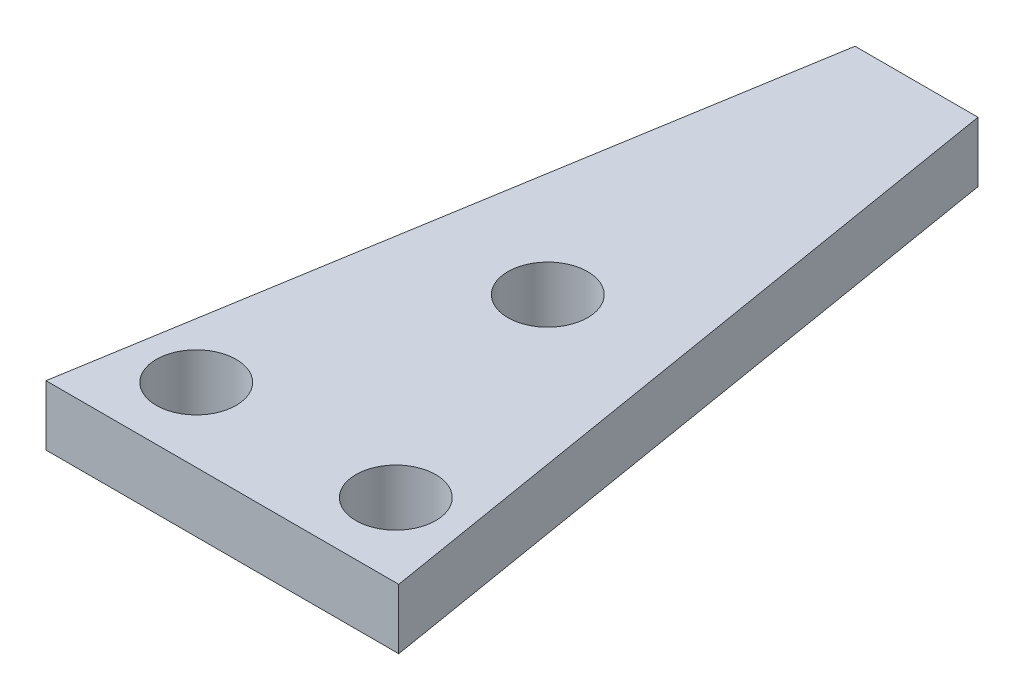
ISO-10303-21;
HEADER;
FILE_DESCRIPTION(('STEP AP214'),'2;1');
FILE_NAME('part.step','',(''),(''),'','','');
FILE_SCHEMA(('AUTOMOTIVE_DESIGN { 1 0 10303 214 1 1 1 1 }'));
ENDSEC;
DATA;
#1=APPLICATION_CONTEXT('core data for automotive mechanical design processes');
#2=APPLICATION_PROTOCOL_DEFINITION('international standard','automotive_design',2000,#1);
#3=PRODUCT_CONTEXT('',#1,'mechanical');
#4=PRODUCT('Part','Part','',(#3));
#5=PRODUCT_RELATED_PRODUCT_CATEGORY('part','',(#4));
#6=PRODUCT_DEFINITION_FORMATION('','',#4);
#7=PRODUCT_DEFINITION_CONTEXT('part definition',#1,'design');
#8=PRODUCT_DEFINITION('design','',#6,#7);
#9=PRODUCT_DEFINITION_SHAPE('','',#8);
#10=(LENGTH_UNIT() NAMED_UNIT(*) SI_UNIT(.MILLI.,.METRE.));
#11=(NAMED_UNIT(*) PLANE_ANGLE_UNIT() SI_UNIT($,.RADIAN.));
#12=(NAMED_UNIT(*) SI_UNIT($,.STERADIAN.) SOLID_ANGLE_UNIT());
#13=UNCERTAINTY_MEASURE_WITH_UNIT(LENGTH_MEASURE(1.E-05),#10,'distance_accuracy_value','');
#14=(GEOMETRIC_REPRESENTATION_CONTEXT(3) GLOBAL_UNCERTAINTY_ASSIGNED_CONTEXT((#13)) GLOBAL_UNIT_ASSIGNED_CONTEXT((#10,
#11,#12)) REPRESENTATION_CONTEXT('',''));
#15=CARTESIAN_POINT('',(0.,0.,0.));
#16=DIRECTION('',(0.,0.,1.));
#17=DIRECTION('',(1.,0.,0.));
#18=AXIS2_PLACEMENT_3D('',#15,#16,#17);
#19=CARTESIAN_POINT('',(0.,-2.39395,0.));
#20=DIRECTION('',(0.,1.,0.));
#21=DIRECTION('',(0.,0.,1.));
#22=AXIS2_PLACEMENT_3D('',#19,#20,#21);
#23=PLANE('',#22);
#24=DIRECTION('',(-1.,0.,0.));
#25=VECTOR('',#24,1.);
#26=CARTESIAN_POINT('',(0.,-2.39395,-9.68375));
#27=LINE('',#26,#25);
#28=CARTESIAN_POINT('',(18.6295862068966,-2.39395,-9.68375));
#29=VERTEX_POINT('',#28);
#30=CARTESIAN_POINT('',(-18.6295862068965,-2.39395,-9.68375));
#31=VERTEX_POINT('',#30);
#32=EDGE_CURVE('E117',#29,#31,#27,.T.);
#33=ORIENTED_EDGE('',*,*,#32,.T.);
#34=DIRECTION('',(-0.163295536240029,0.,0.986577198116844));
#35=VECTOR('',#34,1.);
#36=CARTESIAN_POINT('',(-19.692907735753,-2.39395,-3.2595157631591));
#37=LINE('',#36,#35);
#38=CARTESIAN_POINT('',(-6.49401751743431,-2.39395,-83.0028108321678));
#39=VERTEX_POINT('',#38);
#40=EDGE_CURVE('E123',#39,#31,#37,.T.);
#41=ORIENTED_EDGE('',*,*,#40,.F.);
#42=DIRECTION('',(1.,0.,0.));
#43=VECTOR('',#42,1.);
#44=CARTESIAN_POINT('',(0.,-2.39395,-83.0028108321678));
#45=LINE('',#44,#43);
#46=CARTESIAN_POINT('',(6.49401751743428,-2.39395,-83.0028108321678));
#47=VERTEX_POINT('',#46);
#48=EDGE_CURVE('E121',#39,#47,#45,.T.);
#49=ORIENTED_EDGE('',*,*,#48,.T.);
#50=DIRECTION('',(-0.163295536240029,0.,-0.986577198116843));
#51=VECTOR('',#50,1.);
#52=CARTESIAN_POINT('',(19.692907735753,-2.39395,-3.25951576315911));
#53=LINE('',#52,#51);
#54=EDGE_CURVE('E99',#29,#47,#53,.T.);
#55=ORIENTED_EDGE('',*,*,#54,.F.);
#56=EDGE_LOOP('',(#33,#41,#49,#55));
#57=FACE_BOUND('',#56,.T.);
#58=CARTESIAN_POINT('',(-10.541,-2.39395,-17.4625));
#59=DIRECTION('',(0.,1.,0.));
#60=DIRECTION('',(0.,0.,1.));
#61=AXIS2_PLACEMENT_3D('',#58,#59,#60);
#62=CIRCLE('',#61,4.2164);
#63=CARTESIAN_POINT('',(-10.541,-2.39395,-13.2461));
#64=VERTEX_POINT('',#63);
#65=EDGE_CURVE('E125',#64,#64,#62,.F.);
#66=ORIENTED_EDGE('',*,*,#65,.F.);
#67=EDGE_LOOP('',(#66));
#68=FACE_BOUND('',#67,.T.);
#69=CARTESIAN_POINT('',(10.541,-2.39395,-17.4625));
#70=DIRECTION('',(0.,1.,0.));
#71=DIRECTION('',(0.,0.,1.));
#72=AXIS2_PLACEMENT_3D('',#69,#70,#71);
#73=CIRCLE('',#72,4.2164);
#74=CARTESIAN_POINT('',(10.541,-2.39395,-13.2461));
#75=VERTEX_POINT('',#74);
#76=EDGE_CURVE('E128',#75,#75,#73,.F.);
#77=ORIENTED_EDGE('',*,*,#76,.F.);
#78=EDGE_LOOP('',(#77));
#79=FACE_BOUND('',#78,.T.);
#80=CARTESIAN_POINT('',(0.,-2.39395,-44.053125));
#81=DIRECTION('',(0.,1.,0.));
#82=DIRECTION('',(0.,0.,1.));
#83=AXIS2_PLACEMENT_3D('',#80,#81,#82);
#84=CIRCLE('',#83,4.2164);
#85=CARTESIAN_POINT('',(0.,-2.39395,-39.836725));
#86=VERTEX_POINT('',#85);
#87=EDGE_CURVE('E131',#86,#86,#84,.F.);
#88=ORIENTED_EDGE('',*,*,#87,.F.);
#89=EDGE_LOOP('',(#88));
#90=FACE_BOUND('',#89,.T.);
#91=ADVANCED_FACE('F43',(#57,#68,#79,#90),#23,.F.);
#92=CARTESIAN_POINT('',(-19.692907735753,3.95605,-3.2595157631591));
#93=DIRECTION('',(0.986577198116844,0.,0.163295536240029));
#94=DIRECTION('',(0.163295536240029,0.,-0.986577198116844));
#95=AXIS2_PLACEMENT_3D('',#92,#93,#94);
#96=PLANE('',#95);
#97=ORIENTED_EDGE('',*,*,#40,.T.);
#98=DIRECTION('',(0.,-1.,0.));
#99=VECTOR('',#98,1.);
#100=CARTESIAN_POINT('',(-18.6295862068965,3.95605,-9.68375));
#101=LINE('',#100,#99);
#102=CARTESIAN_POINT('',(-18.6295862068965,3.95605,-9.68375));
#103=VERTEX_POINT('',#102);
#104=EDGE_CURVE('E82',#103,#31,#101,.T.);
#105=ORIENTED_EDGE('',*,*,#104,.F.);
#106=DIRECTION('',(-0.163295536240029,0.,0.986577198116844));
#107=VECTOR('',#106,1.);
#108=CARTESIAN_POINT('',(-19.692907735753,3.95605,-3.2595157631591));
#109=LINE('',#108,#107);
#110=CARTESIAN_POINT('',(-6.49401751743431,3.95605,-83.0028108321678));
#111=VERTEX_POINT('',#110);
#112=EDGE_CURVE('E60',#111,#103,#109,.T.);
#113=ORIENTED_EDGE('',*,*,#112,.F.);
#114=DIRECTION('',(0.,-1.,0.));
#115=VECTOR('',#114,1.);
#116=CARTESIAN_POINT('',(-6.49401751743431,3.95605,-83.0028108321678));
#117=LINE('',#116,#115);
#118=EDGE_CURVE('E75',#111,#39,#117,.T.);
#119=ORIENTED_EDGE('',*,*,#118,.T.);
#120=EDGE_LOOP('',(#97,#105,#113,#119));
#121=FACE_BOUND('',#120,.T.);
#122=ADVANCED_FACE('F138',(#121),#96,.F.);
#123=CARTESIAN_POINT('',(0.,3.95605,-9.68375));
#124=DIRECTION('',(0.,0.,1.));
#125=DIRECTION('',(1.,0.,0.));
#126=AXIS2_PLACEMENT_3D('',#123,#124,#125);
#127=PLANE('',#126);
#128=ORIENTED_EDGE('',*,*,#32,.F.);
#129=DIRECTION('',(0.,-1.,0.));
#130=VECTOR('',#129,1.);
#131=CARTESIAN_POINT('',(18.6295862068966,3.95605,-9.68375));
#132=LINE('',#131,#130);
#133=CARTESIAN_POINT('',(18.6295862068966,3.95605,-9.68375));
#134=VERTEX_POINT('',#133);
#135=EDGE_CURVE('E11',#134,#29,#132,.T.);
#136=ORIENTED_EDGE('',*,*,#135,.F.);
#137=DIRECTION('',(-1.,0.,0.));
#138=VECTOR('',#137,1.);
#139=CARTESIAN_POINT('',(0.,3.95605,-9.68375));
#140=LINE('',#139,#138);
#141=EDGE_CURVE('E93',#134,#103,#140,.T.);
#142=ORIENTED_EDGE('',*,*,#141,.T.);
#143=ORIENTED_EDGE('',*,*,#104,.T.);
#144=EDGE_LOOP('',(#128,#136,#142,#143));
#145=FACE_BOUND('',#144,.T.);
#146=ADVANCED_FACE('F45',(#145),#127,.T.);
#147=CARTESIAN_POINT('',(0.,3.95605,0.));
#148=DIRECTION('',(0.,1.,0.));
#149=DIRECTION('',(0.,0.,1.));
#150=AXIS2_PLACEMENT_3D('',#147,#148,#149);
#151=PLANE('',#150);
#152=ORIENTED_EDGE('',*,*,#141,.F.);
#153=DIRECTION('',(-0.163295536240029,0.,-0.986577198116843));
#154=VECTOR('',#153,1.);
#155=CARTESIAN_POINT('',(19.692907735753,3.95605,-3.25951576315911));
#156=LINE('',#155,#154);
#157=CARTESIAN_POINT('',(6.49401751743428,3.95605,-83.0028108321678));
#158=VERTEX_POINT('',#157);
#159=EDGE_CURVE('E87',#134,#158,#156,.T.);
#160=ORIENTED_EDGE('',*,*,#159,.T.);
#161=DIRECTION('',(1.,0.,0.));
#162=VECTOR('',#161,1.);
#163=CARTESIAN_POINT('',(0.,3.95605,-83.0028108321678));
#164=LINE('',#163,#162);
#165=EDGE_CURVE('E92',#111,#158,#164,.T.);
#166=ORIENTED_EDGE('',*,*,#165,.F.);
#167=ORIENTED_EDGE('',*,*,#112,.T.);
#168=EDGE_LOOP('',(#152,#160,#166,#167));
#169=FACE_BOUND('',#168,.T.);
#170=CARTESIAN_POINT('',(-10.541,3.95605,-17.4625));
#171=DIRECTION('',(0.,1.,0.));
#172=DIRECTION('',(0.,0.,1.));
#173=AXIS2_PLACEMENT_3D('',#170,#171,#172);
#174=CIRCLE('',#173,4.2164);
#175=CARTESIAN_POINT('',(-10.541,3.95605,-13.2461));
#176=VERTEX_POINT('',#175);
#177=EDGE_CURVE('E105',#176,#176,#174,.F.);
#178=ORIENTED_EDGE('',*,*,#177,.T.);
#179=EDGE_LOOP('',(#178));
#180=FACE_BOUND('',#179,.T.);
#181=CARTESIAN_POINT('',(10.541,3.95605,-17.4625));
#182=DIRECTION('',(0.,1.,0.));
#183=DIRECTION('',(0.,0.,1.));
#184=AXIS2_PLACEMENT_3D('',#181,#182,#183);
#185=CIRCLE('',#184,4.2164);
#186=CARTESIAN_POINT('',(10.541,3.95605,-13.2461));
#187=VERTEX_POINT('',#186);
#188=EDGE_CURVE('E111',#187,#187,#185,.F.);
#189=ORIENTED_EDGE('',*,*,#188,.T.);
#190=EDGE_LOOP('',(#189));
#191=FACE_BOUND('',#190,.T.);
#192=CARTESIAN_POINT('',(0.,3.95605,-44.053125));
#193=DIRECTION('',(0.,1.,0.));
#194=DIRECTION('',(0.,0.,1.));
#195=AXIS2_PLACEMENT_3D('',#192,#193,#194);
#196=CIRCLE('',#195,4.2164);
#197=CARTESIAN_POINT('',(0.,3.95605,-39.836725));
#198=VERTEX_POINT('',#197);
#199=EDGE_CURVE('E114',#198,#198,#196,.F.);
#200=ORIENTED_EDGE('',*,*,#199,.T.);
#201=EDGE_LOOP('',(#200));
#202=FACE_BOUND('',#201,.T.);
#203=ADVANCED_FACE('F89',(#169,#180,#191,#202),#151,.T.);
#204=CARTESIAN_POINT('',(0.,3.95605,-44.053125));
#205=DIRECTION('',(0.,-1.,0.));
#206=DIRECTION('',(0.,0.,-1.));
#207=AXIS2_PLACEMENT_3D('',#204,#205,#206);
#208=CYLINDRICAL_SURFACE('',#207,4.2164);
#209=ORIENTED_EDGE('',*,*,#199,.F.);
#210=EDGE_LOOP('',(#209));
#211=FACE_BOUND('',#210,.T.);
#212=ORIENTED_EDGE('',*,*,#87,.T.);
#213=EDGE_LOOP('',(#212));
#214=FACE_BOUND('',#213,.T.);
#215=ADVANCED_FACE('F142',(#211,#214),#208,.F.);
#216=CARTESIAN_POINT('',(10.541,3.95605,-17.4625));
#217=DIRECTION('',(0.,-1.,0.));
#218=DIRECTION('',(0.,0.,-1.));
#219=AXIS2_PLACEMENT_3D('',#216,#217,#218);
#220=CYLINDRICAL_SURFACE('',#219,4.2164);
#221=ORIENTED_EDGE('',*,*,#188,.F.);
#222=EDGE_LOOP('',(#221));
#223=FACE_BOUND('',#222,.T.);
#224=ORIENTED_EDGE('',*,*,#76,.T.);
#225=EDGE_LOOP('',(#224));
#226=FACE_BOUND('',#225,.T.);
#227=ADVANCED_FACE('F168',(#223,#226),#220,.F.);
#228=CARTESIAN_POINT('',(-10.541,3.95605,-17.4625));
#229=DIRECTION('',(0.,-1.,0.));
#230=DIRECTION('',(0.,0.,-1.));
#231=AXIS2_PLACEMENT_3D('',#228,#229,#230);
#232=CYLINDRICAL_SURFACE('',#231,4.2164);
#233=ORIENTED_EDGE('',*,*,#177,.F.);
#234=EDGE_LOOP('',(#233));
#235=FACE_BOUND('',#234,.T.);
#236=ORIENTED_EDGE('',*,*,#65,.T.);
#237=EDGE_LOOP('',(#236));
#238=FACE_BOUND('',#237,.T.);
#239=ADVANCED_FACE('F153',(#235,#238),#232,.F.);
#240=CARTESIAN_POINT('',(0.,3.95605,-83.0028108321678));
#241=DIRECTION('',(0.,0.,-1.));
#242=DIRECTION('',(-1.,0.,0.));
#243=AXIS2_PLACEMENT_3D('',#240,#241,#242);
#244=PLANE('',#243);
#245=ORIENTED_EDGE('',*,*,#48,.F.);
#246=ORIENTED_EDGE('',*,*,#118,.F.);
#247=ORIENTED_EDGE('',*,*,#165,.T.);
#248=DIRECTION('',(0.,-1.,0.));
#249=VECTOR('',#248,1.);
#250=CARTESIAN_POINT('',(6.49401751743428,3.95605,-83.0028108321678));
#251=LINE('',#250,#249);
#252=EDGE_CURVE('E52',#158,#47,#251,.T.);
#253=ORIENTED_EDGE('',*,*,#252,.T.);
#254=EDGE_LOOP('',(#245,#246,#247,#253));
#255=FACE_BOUND('',#254,.T.);
#256=ADVANCED_FACE('F103',(#255),#244,.T.);
#257=CARTESIAN_POINT('',(19.692907735753,3.95605,-3.25951576315911));
#258=DIRECTION('',(-0.986577198116843,0.,0.163295536240029));
#259=DIRECTION('',(0.163295536240029,0.,0.986577198116843));
#260=AXIS2_PLACEMENT_3D('',#257,#258,#259);
#261=PLANE('',#260);
#262=ORIENTED_EDGE('',*,*,#54,.T.);
#263=ORIENTED_EDGE('',*,*,#252,.F.);
#264=ORIENTED_EDGE('',*,*,#159,.F.);
#265=ORIENTED_EDGE('',*,*,#135,.T.);
#266=EDGE_LOOP('',(#262,#263,#264,#265));
#267=FACE_BOUND('',#266,.T.);
#268=ADVANCED_FACE('F97',(#267),#261,.F.);
#269=CLOSED_SHELL('',(#91,#122,#146,#203,#215,#227,#239,#256,#268));
#270=MANIFOLD_SOLID_BREP('B2',#269);
#271=ADVANCED_BREP_SHAPE_REPRESENTATION('',(#18,#270),#14);
#272=SHAPE_DEFINITION_REPRESENTATION(#9,#271);
ENDSEC;
END-ISO-10303-21;
